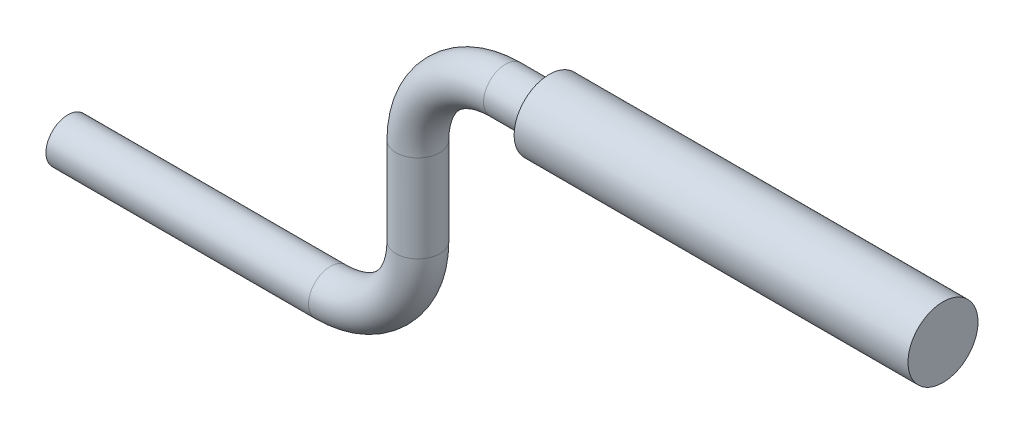
ISO-10303-21;
HEADER;
FILE_DESCRIPTION(('STEP AP214'),'2;1');
FILE_NAME('part.step','',(''),(''),'','','');
FILE_SCHEMA(('AUTOMOTIVE_DESIGN { 1 0 10303 214 1 1 1 1 }'));
ENDSEC;
DATA;
#1=APPLICATION_CONTEXT('core data for automotive mechanical design processes');
#2=APPLICATION_PROTOCOL_DEFINITION('international standard','automotive_design',2000,#1);
#3=PRODUCT_CONTEXT('',#1,'mechanical');
#4=PRODUCT('Part','Part','',(#3));
#5=PRODUCT_RELATED_PRODUCT_CATEGORY('part','',(#4));
#6=PRODUCT_DEFINITION_FORMATION('','',#4);
#7=PRODUCT_DEFINITION_CONTEXT('part definition',#1,'design');
#8=PRODUCT_DEFINITION('design','',#6,#7);
#9=PRODUCT_DEFINITION_SHAPE('','',#8);
#10=(LENGTH_UNIT() NAMED_UNIT(*) SI_UNIT(.MILLI.,.METRE.));
#11=(NAMED_UNIT(*) PLANE_ANGLE_UNIT() SI_UNIT($,.RADIAN.));
#12=(NAMED_UNIT(*) SI_UNIT($,.STERADIAN.) SOLID_ANGLE_UNIT());
#13=UNCERTAINTY_MEASURE_WITH_UNIT(LENGTH_MEASURE(1.E-05),#10,'distance_accuracy_value','');
#14=(GEOMETRIC_REPRESENTATION_CONTEXT(3) GLOBAL_UNCERTAINTY_ASSIGNED_CONTEXT((#13)) GLOBAL_UNIT_ASSIGNED_CONTEXT((#10,
#11,#12)) REPRESENTATION_CONTEXT('',''));
#15=CARTESIAN_POINT('',(0.,0.,0.));
#16=DIRECTION('',(0.,0.,1.));
#17=DIRECTION('',(1.,0.,0.));
#18=AXIS2_PLACEMENT_3D('',#15,#16,#17);
#19=CARTESIAN_POINT('',(50.0000000000001,30.,0.));
#20=DIRECTION('',(1.,0.,0.));
#21=DIRECTION('',(0.,0.,-1.));
#22=AXIS2_PLACEMENT_3D('',#19,#20,#21);
#23=CYLINDRICAL_SURFACE('',#22,2.5);
#24=CARTESIAN_POINT('',(49.9999999999999,30.0000000000007,0.));
#25=DIRECTION('',(1.,0.,0.));
#26=DIRECTION('',(0.,0.,-1.));
#27=AXIS2_PLACEMENT_3D('',#24,#25,#26);
#28=CIRCLE('',#27,2.5);
#29=CARTESIAN_POINT('',(49.9999999999998,32.5,0.));
#30=VERTEX_POINT('',#29);
#31=EDGE_CURVE('E11',#30,#30,#28,.T.);
#32=ORIENTED_EDGE('',*,*,#31,.T.);
#33=EDGE_LOOP('',(#32));
#34=FACE_BOUND('',#33,.T.);
#35=CARTESIAN_POINT('',(55.,30.,0.));
#36=DIRECTION('',(1.,0.,0.));
#37=DIRECTION('',(0.,0.,-1.));
#38=AXIS2_PLACEMENT_3D('',#35,#36,#37);
#39=CIRCLE('',#38,2.5);
#40=CARTESIAN_POINT('',(55.,30.,-2.5));
#41=VERTEX_POINT('',#40);
#42=EDGE_CURVE('E40',#41,#41,#39,.F.);
#43=ORIENTED_EDGE('',*,*,#42,.T.);
#44=EDGE_LOOP('',(#43));
#45=FACE_BOUND('',#44,.T.);
#46=ADVANCED_FACE('F36',(#34,#45),#23,.T.);
#47=CARTESIAN_POINT('',(0.,0.,0.));
#48=DIRECTION('',(1.,0.,0.));
#49=DIRECTION('',(0.,0.,-1.));
#50=AXIS2_PLACEMENT_3D('',#47,#48,#49);
#51=PLANE('',#50);
#52=CARTESIAN_POINT('',(0.,0.,0.));
#53=DIRECTION('',(1.,0.,0.));
#54=DIRECTION('',(0.,0.,-1.));
#55=AXIS2_PLACEMENT_3D('',#52,#53,#54);
#56=CIRCLE('',#55,2.5);
#57=CARTESIAN_POINT('',(0.,0.,-2.5));
#58=VERTEX_POINT('',#57);
#59=EDGE_CURVE('E48',#58,#58,#56,.T.);
#60=ORIENTED_EDGE('',*,*,#59,.F.);
#61=EDGE_LOOP('',(#60));
#62=FACE_BOUND('',#61,.T.);
#63=ADVANCED_FACE('F38',(#62),#51,.F.);
#64=CARTESIAN_POINT('',(0.,0.,0.));
#65=DIRECTION('',(1.,0.,0.));
#66=DIRECTION('',(0.,0.,-1.));
#67=AXIS2_PLACEMENT_3D('',#64,#65,#66);
#68=CYLINDRICAL_SURFACE('',#67,2.5);
#69=CARTESIAN_POINT('',(29.9999999999999,0.,0.));
#70=DIRECTION('',(1.,0.,0.));
#71=DIRECTION('',(0.,0.,-1.));
#72=AXIS2_PLACEMENT_3D('',#69,#70,#71);
#73=CIRCLE('',#72,2.5);
#74=CARTESIAN_POINT('',(29.9999999999999,-2.49999999999929,0.));
#75=VERTEX_POINT('',#74);
#76=EDGE_CURVE('E50',#75,#75,#73,.T.);
#77=ORIENTED_EDGE('',*,*,#76,.F.);
#78=EDGE_LOOP('',(#77));
#79=FACE_BOUND('',#78,.T.);
#80=ORIENTED_EDGE('',*,*,#59,.T.);
#81=EDGE_LOOP('',(#80));
#82=FACE_BOUND('',#81,.T.);
#83=ADVANCED_FACE('F77',(#79,#82),#68,.T.);
#84=CARTESIAN_POINT('',(30.,9.99999999999998,0.));
#85=DIRECTION('',(0.,0.,1.));
#86=DIRECTION('',(1.,0.,0.));
#87=AXIS2_PLACEMENT_3D('',#84,#85,#86);
#88=TOROIDAL_SURFACE('',#87,9.99999999999927,2.5);
#89=CARTESIAN_POINT('',(40.,9.99999999999999,0.));
#90=DIRECTION('',(0.,1.,0.));
#91=DIRECTION('',(0.,0.,-1.));
#92=AXIS2_PLACEMENT_3D('',#89,#90,#91);
#93=CIRCLE('',#92,2.5);
#94=CARTESIAN_POINT('',(42.4999999999993,9.99999999999999,0.));
#95=VERTEX_POINT('',#94);
#96=EDGE_CURVE('E53',#95,#95,#93,.T.);
#97=CARTESIAN_POINT('',(30.,9.99999999999998,0.));
#98=DIRECTION('',(0.,0.,1.));
#99=DIRECTION('',(1.,0.,0.));
#100=AXIS2_PLACEMENT_3D('',#97,#98,#99);
#101=CIRCLE('',#100,12.4999999999993);
#102=EDGE_CURVE('',#75,#95,#101,.T.);
#103=ORIENTED_EDGE('',*,*,#76,.T.);
#104=ORIENTED_EDGE('',*,*,#96,.F.);
#105=ORIENTED_EDGE('',*,*,#102,.T.);
#106=ORIENTED_EDGE('',*,*,#102,.F.);
#107=EDGE_LOOP('',(#103,#105,#104,#106));
#108=FACE_BOUND('',#107,.T.);
#109=ADVANCED_FACE('F71',(#108),#88,.T.);
#110=CARTESIAN_POINT('',(40.,9.99999999999999,0.));
#111=DIRECTION('',(0.,1.,0.));
#112=DIRECTION('',(0.,0.,1.));
#113=AXIS2_PLACEMENT_3D('',#110,#111,#112);
#114=CYLINDRICAL_SURFACE('',#113,2.5);
#115=CARTESIAN_POINT('',(40.,19.9999999999999,0.));
#116=DIRECTION('',(0.,1.,0.));
#117=DIRECTION('',(0.,0.,-1.));
#118=AXIS2_PLACEMENT_3D('',#115,#116,#117);
#119=CIRCLE('',#118,2.5);
#120=CARTESIAN_POINT('',(37.5,19.9999999999999,0.));
#121=VERTEX_POINT('',#120);
#122=EDGE_CURVE('E44',#121,#121,#119,.T.);
#123=ORIENTED_EDGE('',*,*,#122,.F.);
#124=EDGE_LOOP('',(#123));
#125=FACE_BOUND('',#124,.T.);
#126=ORIENTED_EDGE('',*,*,#96,.T.);
#127=EDGE_LOOP('',(#126));
#128=FACE_BOUND('',#127,.T.);
#129=ADVANCED_FACE('F68',(#125,#128),#114,.T.);
#130=CARTESIAN_POINT('',(50.,20.,0.));
#131=DIRECTION('',(0.,0.,-1.));
#132=DIRECTION('',(-1.,0.,0.));
#133=AXIS2_PLACEMENT_3D('',#130,#131,#132);
#134=TOROIDAL_SURFACE('',#133,9.99999999999999,2.5);
#135=CARTESIAN_POINT('',(50.,20.,0.));
#136=DIRECTION('',(0.,0.,-1.));
#137=DIRECTION('',(-1.,0.,0.));
#138=AXIS2_PLACEMENT_3D('',#135,#136,#137);
#139=CIRCLE('',#138,12.5);
#140=EDGE_CURVE('',#121,#30,#139,.T.);
#141=ORIENTED_EDGE('',*,*,#122,.T.);
#142=ORIENTED_EDGE('',*,*,#31,.F.);
#143=ORIENTED_EDGE('',*,*,#140,.T.);
#144=ORIENTED_EDGE('',*,*,#140,.F.);
#145=EDGE_LOOP('',(#141,#143,#142,#144));
#146=FACE_BOUND('',#145,.T.);
#147=ADVANCED_FACE('F66',(#146),#134,.T.);
#148=CARTESIAN_POINT('',(55.,30.,0.));
#149=DIRECTION('',(1.,0.,0.));
#150=DIRECTION('',(0.,0.,-1.));
#151=AXIS2_PLACEMENT_3D('',#148,#149,#150);
#152=CYLINDRICAL_SURFACE('',#151,4.);
#153=CARTESIAN_POINT('',(55.,30.,0.));
#154=DIRECTION('',(1.,0.,0.));
#155=DIRECTION('',(0.,0.,-1.));
#156=AXIS2_PLACEMENT_3D('',#153,#154,#155);
#157=CIRCLE('',#156,4.);
#158=CARTESIAN_POINT('',(55.,30.,-4.));
#159=VERTEX_POINT('',#158);
#160=EDGE_CURVE('E56',#159,#159,#157,.T.);
#161=CARTESIAN_POINT('',(100.,30.,0.));
#162=DIRECTION('',(1.,0.,0.));
#163=DIRECTION('',(0.,0.,-1.));
#164=AXIS2_PLACEMENT_3D('',#161,#162,#163);
#165=CIRCLE('',#164,4.);
#166=CARTESIAN_POINT('',(100.,30.,-4.));
#167=VERTEX_POINT('',#166);
#168=EDGE_CURVE('E58',#167,#167,#165,.T.);
#169=CARTESIAN_POINT('',(55.,30.,-4.));
#170=CARTESIAN_POINT('',(55.46875,30.,-4.));
#171=CARTESIAN_POINT('',(55.9375,30.,-4.));
#172=CARTESIAN_POINT('',(56.875,30.,-4.));
#173=CARTESIAN_POINT('',(57.34375,30.,-4.));
#174=CARTESIAN_POINT('',(58.28125,30.,-4.));
#175=CARTESIAN_POINT('',(58.75,30.,-4.));
#176=CARTESIAN_POINT('',(59.6875,30.,-4.));
#177=CARTESIAN_POINT('',(60.15625,30.,-4.));
#178=CARTESIAN_POINT('',(61.09375,30.,-4.));
#179=CARTESIAN_POINT('',(61.5625,30.,-4.));
#180=CARTESIAN_POINT('',(62.5,30.,-4.));
#181=CARTESIAN_POINT('',(62.96875,30.,-4.));
#182=CARTESIAN_POINT('',(63.90625,30.,-4.));
#183=CARTESIAN_POINT('',(64.375,30.,-4.));
#184=CARTESIAN_POINT('',(65.3125,30.,-4.));
#185=CARTESIAN_POINT('',(65.78125,30.,-4.));
#186=CARTESIAN_POINT('',(66.71875,30.,-4.));
#187=CARTESIAN_POINT('',(67.1875,30.,-4.));
#188=CARTESIAN_POINT('',(68.125,30.,-4.));
#189=CARTESIAN_POINT('',(68.59375,30.,-4.));
#190=CARTESIAN_POINT('',(69.53125,30.,-4.));
#191=CARTESIAN_POINT('',(70.,30.,-4.));
#192=CARTESIAN_POINT('',(70.9375,30.,-4.));
#193=CARTESIAN_POINT('',(71.40625,30.,-4.));
#194=CARTESIAN_POINT('',(72.34375,30.,-4.));
#195=CARTESIAN_POINT('',(72.8125,30.,-4.));
#196=CARTESIAN_POINT('',(73.75,30.,-4.));
#197=CARTESIAN_POINT('',(74.21875,30.,-4.));
#198=CARTESIAN_POINT('',(75.15625,30.,-4.));
#199=CARTESIAN_POINT('',(75.625,30.,-4.));
#200=CARTESIAN_POINT('',(76.5625,30.,-4.));
#201=CARTESIAN_POINT('',(77.03125,30.,-4.));
#202=CARTESIAN_POINT('',(77.96875,30.,-4.));
#203=CARTESIAN_POINT('',(78.4375,30.,-4.));
#204=CARTESIAN_POINT('',(79.375,30.,-4.));
#205=CARTESIAN_POINT('',(79.84375,30.,-4.));
#206=CARTESIAN_POINT('',(80.78125,30.,-4.));
#207=CARTESIAN_POINT('',(81.25,30.,-4.));
#208=CARTESIAN_POINT('',(82.1875,30.,-4.));
#209=CARTESIAN_POINT('',(82.65625,30.,-4.));
#210=CARTESIAN_POINT('',(83.59375,30.,-4.));
#211=CARTESIAN_POINT('',(84.0625,30.,-4.));
#212=CARTESIAN_POINT('',(85.,30.,-4.));
#213=CARTESIAN_POINT('',(85.46875,30.,-4.));
#214=CARTESIAN_POINT('',(86.40625,30.,-4.));
#215=CARTESIAN_POINT('',(86.875,30.,-4.));
#216=CARTESIAN_POINT('',(87.8125,30.,-4.));
#217=CARTESIAN_POINT('',(88.28125,30.,-4.));
#218=CARTESIAN_POINT('',(89.21875,30.,-4.));
#219=CARTESIAN_POINT('',(89.6875,30.,-4.));
#220=CARTESIAN_POINT('',(90.625,30.,-4.));
#221=CARTESIAN_POINT('',(91.09375,30.,-4.));
#222=CARTESIAN_POINT('',(92.03125,30.,-4.));
#223=CARTESIAN_POINT('',(92.5,30.,-4.));
#224=CARTESIAN_POINT('',(93.4375,30.,-4.));
#225=CARTESIAN_POINT('',(93.90625,30.,-4.));
#226=CARTESIAN_POINT('',(94.84375,30.,-4.));
#227=CARTESIAN_POINT('',(95.3125,30.,-4.));
#228=CARTESIAN_POINT('',(96.25,30.,-4.));
#229=CARTESIAN_POINT('',(96.71875,30.,-4.));
#230=CARTESIAN_POINT('',(97.65625,30.,-4.));
#231=CARTESIAN_POINT('',(98.125,30.,-4.));
#232=CARTESIAN_POINT('',(99.0625,30.,-4.));
#233=CARTESIAN_POINT('',(99.53125,30.,-4.));
#234=CARTESIAN_POINT('',(100.,30.,-4.));
#235=B_SPLINE_CURVE_WITH_KNOTS('',3,(#169,#170,#171,#172,#173,#174,#175,#176,#177,#178,#179,
#180,#181,#182,#183,#184,#185,#186,#187,#188,#189,#190,#191,#192,#193,#194,#195,#196,#197,#198,
#199,#200,#201,#202,#203,#204,#205,#206,#207,#208,#209,#210,#211,#212,#213,#214,#215,#216,#217,
#218,#219,#220,#221,#222,#223,#224,#225,#226,#227,#228,#229,#230,#231,#232,#233,#234),
.UNSPECIFIED.,.F.,.F.,(4,2,2,2,2,2,2,2,2,2,2,2,2,2,2,2,2,2,2,2,2,2,2,2,2,2,2,2,2,2,2,2,4),(0.,
1.40625,2.8125,4.21875,5.625,7.03125,8.43749999999999,9.84375000000001,11.25,12.65625,14.0625,
15.46875,16.875,18.28125,19.6875,21.09375,22.5,23.90625,25.3125,26.71875,28.125,29.53125,
30.9375,32.34375,33.75,35.15625,36.5625,37.96875,39.375,40.78125,42.1875,43.59375,45.),.UNSPECIFIED.);
#236=EDGE_CURVE('BSEAM86',#159,#167,#235,.T.);
#237=ORIENTED_EDGE('',*,*,#160,.T.);
#238=ORIENTED_EDGE('',*,*,#168,.F.);
#239=ORIENTED_EDGE('',*,*,#236,.T.);
#240=ORIENTED_EDGE('',*,*,#236,.F.);
#241=EDGE_LOOP('',(#237,#239,#238,#240));
#242=FACE_BOUND('',#241,.T.);
#243=ADVANCED_FACE('F86',(#242),#152,.T.);
#244=CARTESIAN_POINT('',(55.,30.,0.));
#245=DIRECTION('',(1.,0.,0.));
#246=DIRECTION('',(0.,0.,-1.));
#247=AXIS2_PLACEMENT_3D('',#244,#245,#246);
#248=PLANE('',#247);
#249=ORIENTED_EDGE('',*,*,#42,.F.);
#250=EDGE_LOOP('',(#249));
#251=FACE_BOUND('',#250,.T.);
#252=ORIENTED_EDGE('',*,*,#160,.F.);
#253=EDGE_LOOP('',(#252));
#254=FACE_BOUND('',#253,.T.);
#255=ADVANCED_FACE('F100',(#251,#254),#248,.F.);
#256=CARTESIAN_POINT('',(100.,30.,0.));
#257=DIRECTION('',(1.,0.,0.));
#258=DIRECTION('',(0.,0.,-1.));
#259=AXIS2_PLACEMENT_3D('',#256,#257,#258);
#260=PLANE('',#259);
#261=ORIENTED_EDGE('',*,*,#168,.T.);
#262=EDGE_LOOP('',(#261));
#263=FACE_BOUND('',#262,.T.);
#264=ADVANCED_FACE('F106',(#263),#260,.T.);
#265=CLOSED_SHELL('',(#46,#63,#83,#109,#129,#147,#243,#255,#264));
#266=MANIFOLD_SOLID_BREP('B2',#265);
#267=ADVANCED_BREP_SHAPE_REPRESENTATION('',(#18,#266),#14);
#268=SHAPE_DEFINITION_REPRESENTATION(#9,#267);
ENDSEC;
END-ISO-10303-21;
